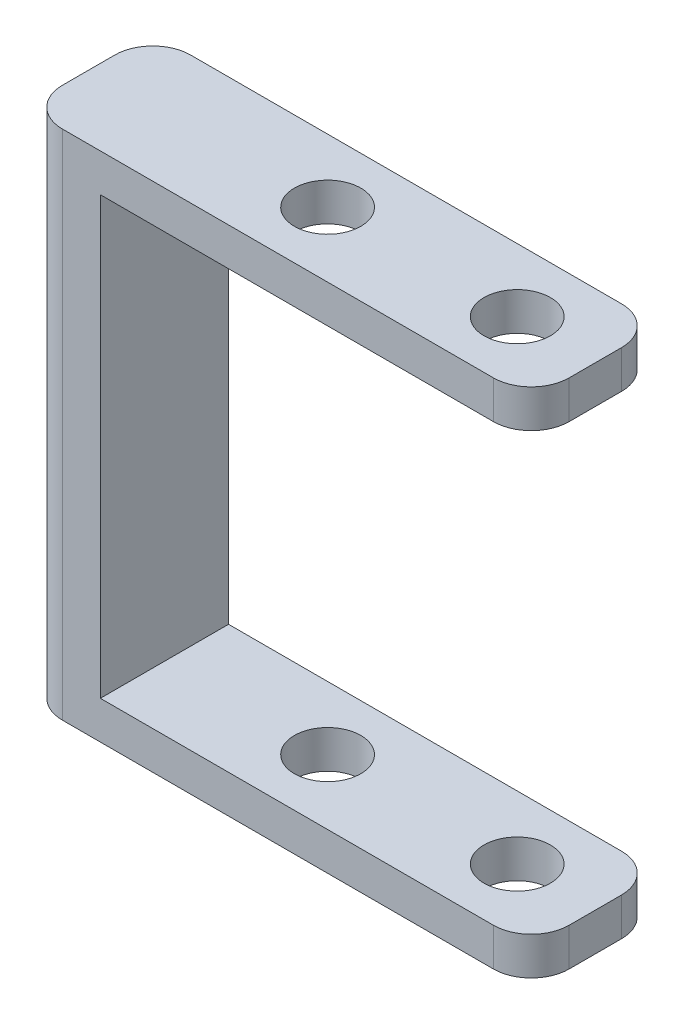
ISO-10303-21;
HEADER;
FILE_DESCRIPTION(('STEP AP214'),'2;1');
FILE_NAME('part.step','',(''),(''),'','','');
FILE_SCHEMA(('AUTOMOTIVE_DESIGN { 1 0 10303 214 1 1 1 1 }'));
ENDSEC;
DATA;
#1=APPLICATION_CONTEXT('core data for automotive mechanical design processes');
#2=APPLICATION_PROTOCOL_DEFINITION('international standard','automotive_design',2000,#1);
#3=PRODUCT_CONTEXT('',#1,'mechanical');
#4=PRODUCT('Part','Part','',(#3));
#5=PRODUCT_RELATED_PRODUCT_CATEGORY('part','',(#4));
#6=PRODUCT_DEFINITION_FORMATION('','',#4);
#7=PRODUCT_DEFINITION_CONTEXT('part definition',#1,'design');
#8=PRODUCT_DEFINITION('design','',#6,#7);
#9=PRODUCT_DEFINITION_SHAPE('','',#8);
#10=(LENGTH_UNIT() NAMED_UNIT(*) SI_UNIT(.MILLI.,.METRE.));
#11=(NAMED_UNIT(*) PLANE_ANGLE_UNIT() SI_UNIT($,.RADIAN.));
#12=(NAMED_UNIT(*) SI_UNIT($,.STERADIAN.) SOLID_ANGLE_UNIT());
#13=UNCERTAINTY_MEASURE_WITH_UNIT(LENGTH_MEASURE(1.E-05),#10,'distance_accuracy_value','');
#14=(GEOMETRIC_REPRESENTATION_CONTEXT(3) GLOBAL_UNCERTAINTY_ASSIGNED_CONTEXT((#13)) GLOBAL_UNIT_ASSIGNED_CONTEXT((#10,
#11,#12)) REPRESENTATION_CONTEXT('',''));
#15=CARTESIAN_POINT('',(0.,0.,0.));
#16=DIRECTION('',(0.,0.,1.));
#17=DIRECTION('',(1.,0.,0.));
#18=AXIS2_PLACEMENT_3D('',#15,#16,#17);
#19=CARTESIAN_POINT('',(8.71849977906767,27.,1.11248743584465));
#20=DIRECTION('',(0.,-1.,0.));
#21=DIRECTION('',(0.,0.,-1.));
#22=AXIS2_PLACEMENT_3D('',#19,#20,#21);
#23=CYLINDRICAL_SURFACE('',#22,2.);
#24=DIRECTION('',(0.,-1.,0.));
#25=VECTOR('',#24,1.);
#26=CARTESIAN_POINT('',(8.71849977906766,27.,3.11248743584465));
#27=LINE('',#26,#25);
#28=CARTESIAN_POINT('',(8.71849977906766,27.,3.11248743584465));
#29=VERTEX_POINT('',#28);
#30=CARTESIAN_POINT('',(8.71849977906765,25.,3.11248743584465));
#31=VERTEX_POINT('',#30);
#32=EDGE_CURVE('E170',#29,#31,#27,.T.);
#33=ORIENTED_EDGE('',*,*,#32,.T.);
#34=CARTESIAN_POINT('',(8.71849977906767,25.,1.11248743584465));
#35=DIRECTION('',(0.,1.,0.));
#36=DIRECTION('',(0.,0.,1.));
#37=AXIS2_PLACEMENT_3D('',#34,#35,#36);
#38=CIRCLE('',#37,2.);
#39=CARTESIAN_POINT('',(10.7184997790677,25.,1.11248743584463));
#40=VERTEX_POINT('',#39);
#41=EDGE_CURVE('E221',#31,#40,#38,.T.);
#42=ORIENTED_EDGE('',*,*,#41,.T.);
#43=DIRECTION('',(0.,-1.,0.));
#44=VECTOR('',#43,1.);
#45=CARTESIAN_POINT('',(10.7184997790677,27.,1.11248743584463));
#46=LINE('',#45,#44);
#47=CARTESIAN_POINT('',(10.7184997790677,27.,1.11248743584463));
#48=VERTEX_POINT('',#47);
#49=EDGE_CURVE('E11',#48,#40,#46,.T.);
#50=ORIENTED_EDGE('',*,*,#49,.F.);
#51=CARTESIAN_POINT('',(8.71849977906767,27.,1.11248743584465));
#52=DIRECTION('',(0.,1.,0.));
#53=DIRECTION('',(0.,0.,1.));
#54=AXIS2_PLACEMENT_3D('',#51,#52,#53);
#55=CIRCLE('',#54,2.);
#56=EDGE_CURVE('E169',#29,#48,#55,.T.);
#57=ORIENTED_EDGE('',*,*,#56,.F.);
#58=EDGE_LOOP('',(#33,#42,#50,#57));
#59=FACE_BOUND('',#58,.T.);
#60=ADVANCED_FACE('F39',(#59),#23,.T.);
#61=CARTESIAN_POINT('',(10.7184997790677,27.,-1.64841242479802));
#62=DIRECTION('',(-1.,0.,0.));
#63=DIRECTION('',(0.,0.,1.));
#64=AXIS2_PLACEMENT_3D('',#61,#62,#63);
#65=PLANE('',#64);
#66=ORIENTED_EDGE('',*,*,#49,.T.);
#67=DIRECTION('',(0.,0.,-1.));
#68=VECTOR('',#67,1.);
#69=CARTESIAN_POINT('',(10.7184997790677,25.,-1.64841242479802));
#70=LINE('',#69,#68);
#71=CARTESIAN_POINT('',(10.7184997790677,25.,-1.64841242479802));
#72=VERTEX_POINT('',#71);
#73=EDGE_CURVE('E218',#40,#72,#70,.T.);
#74=ORIENTED_EDGE('',*,*,#73,.T.);
#75=DIRECTION('',(0.,-1.,0.));
#76=VECTOR('',#75,1.);
#77=CARTESIAN_POINT('',(10.7184997790677,27.,-1.64841242479802));
#78=LINE('',#77,#76);
#79=CARTESIAN_POINT('',(10.7184997790677,27.,-1.64841242479802));
#80=VERTEX_POINT('',#79);
#81=EDGE_CURVE('E183',#80,#72,#78,.T.);
#82=ORIENTED_EDGE('',*,*,#81,.F.);
#83=DIRECTION('',(0.,0.,-1.));
#84=VECTOR('',#83,1.);
#85=CARTESIAN_POINT('',(10.7184997790677,27.,-1.64841242479802));
#86=LINE('',#85,#84);
#87=EDGE_CURVE('E107',#48,#80,#86,.T.);
#88=ORIENTED_EDGE('',*,*,#87,.F.);
#89=EDGE_LOOP('',(#66,#74,#82,#88));
#90=FACE_BOUND('',#89,.T.);
#91=ADVANCED_FACE('F263',(#90),#65,.F.);
#92=CARTESIAN_POINT('',(8.71849977906767,27.,-1.64841242479804));
#93=DIRECTION('',(0.,-1.,0.));
#94=DIRECTION('',(0.,0.,-1.));
#95=AXIS2_PLACEMENT_3D('',#92,#93,#94);
#96=CYLINDRICAL_SURFACE('',#95,2.);
#97=ORIENTED_EDGE('',*,*,#81,.T.);
#98=CARTESIAN_POINT('',(8.71849977906767,25.,-1.64841242479804));
#99=DIRECTION('',(0.,1.,0.));
#100=DIRECTION('',(0.,0.,1.));
#101=AXIS2_PLACEMENT_3D('',#98,#99,#100);
#102=CIRCLE('',#101,2.);
#103=CARTESIAN_POINT('',(8.71849977906765,25.,-3.64841242479804));
#104=VERTEX_POINT('',#103);
#105=EDGE_CURVE('E215',#72,#104,#102,.T.);
#106=ORIENTED_EDGE('',*,*,#105,.T.);
#107=DIRECTION('',(0.,-1.,0.));
#108=VECTOR('',#107,1.);
#109=CARTESIAN_POINT('',(8.71849977906766,27.,-3.64841242479804));
#110=LINE('',#109,#108);
#111=CARTESIAN_POINT('',(8.71849977906766,27.,-3.64841242479804));
#112=VERTEX_POINT('',#111);
#113=EDGE_CURVE('E179',#112,#104,#110,.T.);
#114=ORIENTED_EDGE('',*,*,#113,.F.);
#115=CARTESIAN_POINT('',(8.71849977906767,27.,-1.64841242479804));
#116=DIRECTION('',(0.,1.,0.));
#117=DIRECTION('',(0.,0.,-1.));
#118=AXIS2_PLACEMENT_3D('',#115,#116,#117);
#119=CIRCLE('',#118,2.);
#120=EDGE_CURVE('E237',#80,#112,#119,.T.);
#121=ORIENTED_EDGE('',*,*,#120,.F.);
#122=EDGE_LOOP('',(#97,#106,#114,#121));
#123=FACE_BOUND('',#122,.T.);
#124=ADVANCED_FACE('F267',(#123),#96,.T.);
#125=CARTESIAN_POINT('',(-3.44522513510862,27.,-0.309187493626952));
#126=DIRECTION('',(0.,-1.,0.));
#127=DIRECTION('',(0.,0.,-1.));
#128=AXIS2_PLACEMENT_3D('',#125,#126,#127);
#129=CYLINDRICAL_SURFACE('',#128,1.75);
#130=CARTESIAN_POINT('',(-3.44522513510862,25.,-0.309187493626952));
#131=DIRECTION('',(0.,1.,0.));
#132=DIRECTION('',(0.,0.,1.));
#133=AXIS2_PLACEMENT_3D('',#130,#131,#132);
#134=CIRCLE('',#133,1.75);
#135=CARTESIAN_POINT('',(-3.44522513510862,25.,1.44081250637305));
#136=VERTEX_POINT('',#135);
#137=EDGE_CURVE('E212',#136,#136,#134,.T.);
#138=ORIENTED_EDGE('',*,*,#137,.F.);
#139=EDGE_LOOP('',(#138));
#140=FACE_BOUND('',#139,.T.);
#141=CARTESIAN_POINT('',(-3.44522513510862,27.,-0.309187493626952));
#142=DIRECTION('',(0.,1.,0.));
#143=DIRECTION('',(0.,0.,1.));
#144=AXIS2_PLACEMENT_3D('',#141,#142,#143);
#145=CIRCLE('',#144,1.75);
#146=CARTESIAN_POINT('',(-3.44522513510862,27.,1.44081250637305));
#147=VERTEX_POINT('',#146);
#148=EDGE_CURVE('E154',#147,#147,#145,.T.);
#149=ORIENTED_EDGE('',*,*,#148,.T.);
#150=EDGE_LOOP('',(#149));
#151=FACE_BOUND('',#150,.T.);
#152=ADVANCED_FACE('F324',(#140,#151),#129,.F.);
#153=CARTESIAN_POINT('',(6.55477486489138,27.,-0.309187493626952));
#154=DIRECTION('',(0.,-1.,0.));
#155=DIRECTION('',(0.,0.,-1.));
#156=AXIS2_PLACEMENT_3D('',#153,#154,#155);
#157=CYLINDRICAL_SURFACE('',#156,1.75);
#158=CARTESIAN_POINT('',(6.55477486489138,25.,-0.309187493626952));
#159=DIRECTION('',(0.,1.,0.));
#160=DIRECTION('',(0.,0.,1.));
#161=AXIS2_PLACEMENT_3D('',#158,#159,#160);
#162=CIRCLE('',#161,1.75);
#163=CARTESIAN_POINT('',(6.55477486489138,25.,1.44081250637305));
#164=VERTEX_POINT('',#163);
#165=EDGE_CURVE('E43',#164,#164,#162,.T.);
#166=ORIENTED_EDGE('',*,*,#165,.F.);
#167=EDGE_LOOP('',(#166));
#168=FACE_BOUND('',#167,.T.);
#169=CARTESIAN_POINT('',(6.55477486489138,27.,-0.309187493626952));
#170=DIRECTION('',(0.,1.,0.));
#171=DIRECTION('',(0.,0.,1.));
#172=AXIS2_PLACEMENT_3D('',#169,#170,#171);
#173=CIRCLE('',#172,1.75);
#174=CARTESIAN_POINT('',(6.55477486489138,27.,1.44081250637305));
#175=VERTEX_POINT('',#174);
#176=EDGE_CURVE('E225',#175,#175,#173,.T.);
#177=ORIENTED_EDGE('',*,*,#176,.T.);
#178=EDGE_LOOP('',(#177));
#179=FACE_BOUND('',#178,.T.);
#180=ADVANCED_FACE('F337',(#168,#179),#157,.F.);
#181=CARTESIAN_POINT('',(8.71849977906767,27.,1.11248743584465));
#182=DIRECTION('',(0.,1.,0.));
#183=DIRECTION('',(0.,0.,1.));
#184=AXIS2_PLACEMENT_3D('',#181,#182,#183);
#185=PLANE('',#184);
#186=ORIENTED_EDGE('',*,*,#148,.F.);
#187=EDGE_LOOP('',(#186));
#188=FACE_BOUND('',#187,.T.);
#189=ORIENTED_EDGE('',*,*,#56,.T.);
#190=ORIENTED_EDGE('',*,*,#87,.T.);
#191=ORIENTED_EDGE('',*,*,#120,.T.);
#192=DIRECTION('',(-1.,0.,0.));
#193=VECTOR('',#192,1.);
#194=CARTESIAN_POINT('',(-14.0069651083105,27.,-3.64841242479804));
#195=LINE('',#194,#193);
#196=CARTESIAN_POINT('',(-14.0069651083105,27.,-3.64841242479804));
#197=VERTEX_POINT('',#196);
#198=EDGE_CURVE('E239',#112,#197,#195,.T.);
#199=ORIENTED_EDGE('',*,*,#198,.T.);
#200=CARTESIAN_POINT('',(-14.0069651083105,27.,-1.64841242479804));
#201=DIRECTION('',(0.,1.,0.));
#202=DIRECTION('',(0.,0.,1.));
#203=AXIS2_PLACEMENT_3D('',#200,#201,#202);
#204=CIRCLE('',#203,2.);
#205=CARTESIAN_POINT('',(-16.0069651083105,27.,-1.64841242479804));
#206=VERTEX_POINT('',#205);
#207=EDGE_CURVE('E130',#197,#206,#204,.T.);
#208=ORIENTED_EDGE('',*,*,#207,.T.);
#209=DIRECTION('',(0.,0.,1.));
#210=VECTOR('',#209,1.);
#211=CARTESIAN_POINT('',(-16.0069651083105,27.,-1.64841242479804));
#212=LINE('',#211,#210);
#213=CARTESIAN_POINT('',(-16.0069651083105,27.,1.11248743584465));
#214=VERTEX_POINT('',#213);
#215=EDGE_CURVE('E122',#206,#214,#212,.T.);
#216=ORIENTED_EDGE('',*,*,#215,.T.);
#217=CARTESIAN_POINT('',(-14.0069651083105,27.,1.11248743584465));
#218=DIRECTION('',(0.,1.,0.));
#219=DIRECTION('',(0.,0.,1.));
#220=AXIS2_PLACEMENT_3D('',#217,#218,#219);
#221=CIRCLE('',#220,2.);
#222=CARTESIAN_POINT('',(-14.0069651083105,27.,3.11248743584465));
#223=VERTEX_POINT('',#222);
#224=EDGE_CURVE('E127',#214,#223,#221,.T.);
#225=ORIENTED_EDGE('',*,*,#224,.T.);
#226=DIRECTION('',(1.,0.,0.));
#227=VECTOR('',#226,1.);
#228=CARTESIAN_POINT('',(-14.0069651083105,27.,3.11248743584465));
#229=LINE('',#228,#227);
#230=EDGE_CURVE('E65',#223,#29,#229,.T.);
#231=ORIENTED_EDGE('',*,*,#230,.T.);
#232=EDGE_LOOP('',(#189,#190,#191,#199,#208,#216,#225,#231));
#233=FACE_BOUND('',#232,.T.);
#234=ORIENTED_EDGE('',*,*,#176,.F.);
#235=EDGE_LOOP('',(#234));
#236=FACE_BOUND('',#235,.T.);
#237=ADVANCED_FACE('F124',(#188,#233,#236),#185,.T.);
#238=CARTESIAN_POINT('',(8.71849977906767,0.,1.11248743584465));
#239=DIRECTION('',(0.,1.,0.));
#240=DIRECTION('',(0.,0.,1.));
#241=AXIS2_PLACEMENT_3D('',#238,#239,#240);
#242=PLANE('',#241);
#243=CARTESIAN_POINT('',(8.71849977906767,0.,1.11248743584465));
#244=DIRECTION('',(0.,1.,0.));
#245=DIRECTION('',(0.,0.,1.));
#246=AXIS2_PLACEMENT_3D('',#243,#244,#245);
#247=CIRCLE('',#246,2.);
#248=CARTESIAN_POINT('',(8.71849977906766,0.,3.11248743584465));
#249=VERTEX_POINT('',#248);
#250=CARTESIAN_POINT('',(10.7184997790677,0.,1.11248743584463));
#251=VERTEX_POINT('',#250);
#252=EDGE_CURVE('E151',#249,#251,#247,.T.);
#253=ORIENTED_EDGE('',*,*,#252,.F.);
#254=DIRECTION('',(1.,0.,0.));
#255=VECTOR('',#254,1.);
#256=CARTESIAN_POINT('',(-14.0069651083105,0.,3.11248743584465));
#257=LINE('',#256,#255);
#258=CARTESIAN_POINT('',(-14.0069651083105,0.,3.11248743584465));
#259=VERTEX_POINT('',#258);
#260=EDGE_CURVE('E167',#259,#249,#257,.T.);
#261=ORIENTED_EDGE('',*,*,#260,.F.);
#262=CARTESIAN_POINT('',(-14.0069651083105,0.,1.11248743584465));
#263=DIRECTION('',(0.,1.,0.));
#264=DIRECTION('',(0.,0.,1.));
#265=AXIS2_PLACEMENT_3D('',#262,#263,#264);
#266=CIRCLE('',#265,2.);
#267=CARTESIAN_POINT('',(-16.0069651083105,0.,1.11248743584465));
#268=VERTEX_POINT('',#267);
#269=EDGE_CURVE('E165',#268,#259,#266,.T.);
#270=ORIENTED_EDGE('',*,*,#269,.F.);
#271=DIRECTION('',(0.,0.,1.));
#272=VECTOR('',#271,1.);
#273=CARTESIAN_POINT('',(-16.0069651083105,0.,-1.64841242479804));
#274=LINE('',#273,#272);
#275=CARTESIAN_POINT('',(-16.0069651083105,0.,-1.64841242479804));
#276=VERTEX_POINT('',#275);
#277=EDGE_CURVE('E139',#276,#268,#274,.T.);
#278=ORIENTED_EDGE('',*,*,#277,.F.);
#279=CARTESIAN_POINT('',(-14.0069651083105,0.,-1.64841242479804));
#280=DIRECTION('',(0.,1.,0.));
#281=DIRECTION('',(0.,0.,1.));
#282=AXIS2_PLACEMENT_3D('',#279,#280,#281);
#283=CIRCLE('',#282,2.);
#284=CARTESIAN_POINT('',(-14.0069651083105,0.,-3.64841242479804));
#285=VERTEX_POINT('',#284);
#286=EDGE_CURVE('E162',#285,#276,#283,.T.);
#287=ORIENTED_EDGE('',*,*,#286,.F.);
#288=DIRECTION('',(-1.,0.,0.));
#289=VECTOR('',#288,1.);
#290=CARTESIAN_POINT('',(-14.0069651083105,0.,-3.64841242479804));
#291=LINE('',#290,#289);
#292=CARTESIAN_POINT('',(8.71849977906766,0.,-3.64841242479804));
#293=VERTEX_POINT('',#292);
#294=EDGE_CURVE('E160',#293,#285,#291,.T.);
#295=ORIENTED_EDGE('',*,*,#294,.F.);
#296=CARTESIAN_POINT('',(8.71849977906767,0.,-1.64841242479804));
#297=DIRECTION('',(0.,1.,0.));
#298=DIRECTION('',(0.,0.,-1.));
#299=AXIS2_PLACEMENT_3D('',#296,#297,#298);
#300=CIRCLE('',#299,2.);
#301=CARTESIAN_POINT('',(10.7184997790677,0.,-1.64841242479802));
#302=VERTEX_POINT('',#301);
#303=EDGE_CURVE('E157',#302,#293,#300,.T.);
#304=ORIENTED_EDGE('',*,*,#303,.F.);
#305=DIRECTION('',(0.,0.,-1.));
#306=VECTOR('',#305,1.);
#307=CARTESIAN_POINT('',(10.7184997790677,0.,-1.64841242479802));
#308=LINE('',#307,#306);
#309=EDGE_CURVE('E153',#251,#302,#308,.T.);
#310=ORIENTED_EDGE('',*,*,#309,.F.);
#311=EDGE_LOOP('',(#253,#261,#270,#278,#287,#295,#304,#310));
#312=FACE_BOUND('',#311,.T.);
#313=CARTESIAN_POINT('',(-3.44522513510862,0.,-0.309187493626952));
#314=DIRECTION('',(0.,1.,0.));
#315=DIRECTION('',(0.,0.,1.));
#316=AXIS2_PLACEMENT_3D('',#313,#314,#315);
#317=CIRCLE('',#316,1.75);
#318=CARTESIAN_POINT('',(-3.44522513510862,0.,1.44081250637305));
#319=VERTEX_POINT('',#318);
#320=EDGE_CURVE('E228',#319,#319,#317,.T.);
#321=ORIENTED_EDGE('',*,*,#320,.T.);
#322=EDGE_LOOP('',(#321));
#323=FACE_BOUND('',#322,.T.);
#324=CARTESIAN_POINT('',(6.55477486489138,0.,-0.309187493626952));
#325=DIRECTION('',(0.,1.,0.));
#326=DIRECTION('',(0.,0.,1.));
#327=AXIS2_PLACEMENT_3D('',#324,#325,#326);
#328=CIRCLE('',#327,1.75);
#329=CARTESIAN_POINT('',(6.55477486489138,0.,1.44081250637305));
#330=VERTEX_POINT('',#329);
#331=EDGE_CURVE('E224',#330,#330,#328,.T.);
#332=ORIENTED_EDGE('',*,*,#331,.T.);
#333=EDGE_LOOP('',(#332));
#334=FACE_BOUND('',#333,.T.);
#335=ADVANCED_FACE('F252',(#312,#323,#334),#242,.F.);
#336=CARTESIAN_POINT('',(10.7184997790677,2.,1.11248743584463));
#337=VERTEX_POINT('',#336);
#338=EDGE_CURVE('E48',#337,#251,#46,.T.);
#339=ORIENTED_EDGE('',*,*,#338,.F.);
#340=CARTESIAN_POINT('',(8.71849977906767,2.,1.11248743584465));
#341=DIRECTION('',(0.,-1.,0.));
#342=DIRECTION('',(0.,0.,-1.));
#343=AXIS2_PLACEMENT_3D('',#340,#341,#342);
#344=CIRCLE('',#343,2.);
#345=CARTESIAN_POINT('',(8.71849977906765,2.,3.11248743584465));
#346=VERTEX_POINT('',#345);
#347=EDGE_CURVE('E210',#337,#346,#344,.T.);
#348=ORIENTED_EDGE('',*,*,#347,.T.);
#349=EDGE_CURVE('E99',#346,#249,#27,.T.);
#350=ORIENTED_EDGE('',*,*,#349,.T.);
#351=ORIENTED_EDGE('',*,*,#252,.T.);
#352=EDGE_LOOP('',(#339,#348,#350,#351));
#353=FACE_BOUND('',#352,.T.);
#354=ADVANCED_FACE('F41',(#353),#23,.T.);
#355=CARTESIAN_POINT('',(10.7184997790677,2.,-1.64841242479802));
#356=VERTEX_POINT('',#355);
#357=EDGE_CURVE('E182',#356,#302,#78,.T.);
#358=ORIENTED_EDGE('',*,*,#357,.F.);
#359=DIRECTION('',(0.,0.,1.));
#360=VECTOR('',#359,1.);
#361=CARTESIAN_POINT('',(10.7184997790677,2.,-1.64841242479802));
#362=LINE('',#361,#360);
#363=EDGE_CURVE('E207',#356,#337,#362,.T.);
#364=ORIENTED_EDGE('',*,*,#363,.T.);
#365=ORIENTED_EDGE('',*,*,#338,.T.);
#366=ORIENTED_EDGE('',*,*,#309,.T.);
#367=EDGE_LOOP('',(#358,#364,#365,#366));
#368=FACE_BOUND('',#367,.T.);
#369=ADVANCED_FACE('F312',(#368),#65,.F.);
#370=CARTESIAN_POINT('',(8.71849977906765,2.,-3.64841242479804));
#371=VERTEX_POINT('',#370);
#372=EDGE_CURVE('E178',#371,#293,#110,.T.);
#373=ORIENTED_EDGE('',*,*,#372,.F.);
#374=CARTESIAN_POINT('',(8.71849977906767,2.,-1.64841242479804));
#375=DIRECTION('',(0.,-1.,0.));
#376=DIRECTION('',(0.,0.,-1.));
#377=AXIS2_PLACEMENT_3D('',#374,#375,#376);
#378=CIRCLE('',#377,2.);
#379=EDGE_CURVE('E192',#371,#356,#378,.T.);
#380=ORIENTED_EDGE('',*,*,#379,.T.);
#381=ORIENTED_EDGE('',*,*,#357,.T.);
#382=ORIENTED_EDGE('',*,*,#303,.T.);
#383=EDGE_LOOP('',(#373,#380,#381,#382));
#384=FACE_BOUND('',#383,.T.);
#385=ADVANCED_FACE('F315',(#384),#96,.T.);
#386=CARTESIAN_POINT('',(-14.0069651083105,27.,-3.64841242479804));
#387=DIRECTION('',(0.,0.,1.));
#388=DIRECTION('',(1.,0.,0.));
#389=AXIS2_PLACEMENT_3D('',#386,#387,#388);
#390=PLANE('',#389);
#391=ORIENTED_EDGE('',*,*,#113,.T.);
#392=DIRECTION('',(-1.,0.,0.));
#393=VECTOR('',#392,1.);
#394=CARTESIAN_POINT('',(-12.0069651083105,25.,-3.64841242479804));
#395=LINE('',#394,#393);
#396=CARTESIAN_POINT('',(-12.0069651083105,25.,-3.64841242479804));
#397=VERTEX_POINT('',#396);
#398=EDGE_CURVE('E199',#104,#397,#395,.T.);
#399=ORIENTED_EDGE('',*,*,#398,.T.);
#400=DIRECTION('',(0.,-1.,0.));
#401=VECTOR('',#400,1.);
#402=CARTESIAN_POINT('',(-12.0069651083105,25.,-3.64841242479804));
#403=LINE('',#402,#401);
#404=CARTESIAN_POINT('',(-12.0069651083105,2.,-3.64841242479804));
#405=VERTEX_POINT('',#404);
#406=EDGE_CURVE('E296',#397,#405,#403,.T.);
#407=ORIENTED_EDGE('',*,*,#406,.T.);
#408=DIRECTION('',(1.,0.,0.));
#409=VECTOR('',#408,1.);
#410=CARTESIAN_POINT('',(-12.0069651083105,2.,-3.64841242479804));
#411=LINE('',#410,#409);
#412=EDGE_CURVE('E300',#405,#371,#411,.T.);
#413=ORIENTED_EDGE('',*,*,#412,.T.);
#414=ORIENTED_EDGE('',*,*,#372,.T.);
#415=ORIENTED_EDGE('',*,*,#294,.T.);
#416=DIRECTION('',(0.,-1.,0.));
#417=VECTOR('',#416,1.);
#418=CARTESIAN_POINT('',(-14.0069651083105,27.,-3.64841242479804));
#419=LINE('',#418,#417);
#420=EDGE_CURVE('E175',#197,#285,#419,.T.);
#421=ORIENTED_EDGE('',*,*,#420,.F.);
#422=ORIENTED_EDGE('',*,*,#198,.F.);
#423=EDGE_LOOP('',(#391,#399,#407,#413,#414,#415,#421,#422));
#424=FACE_BOUND('',#423,.T.);
#425=ADVANCED_FACE('F245',(#424),#390,.F.);
#426=CARTESIAN_POINT('',(-14.0069651083105,27.,-1.64841242479804));
#427=DIRECTION('',(0.,-1.,0.));
#428=DIRECTION('',(0.,0.,-1.));
#429=AXIS2_PLACEMENT_3D('',#426,#427,#428);
#430=CYLINDRICAL_SURFACE('',#429,2.);
#431=ORIENTED_EDGE('',*,*,#286,.T.);
#432=DIRECTION('',(0.,-1.,0.));
#433=VECTOR('',#432,1.);
#434=CARTESIAN_POINT('',(-16.0069651083105,27.,-1.64841242479804));
#435=LINE('',#434,#433);
#436=EDGE_CURVE('E142',#206,#276,#435,.T.);
#437=ORIENTED_EDGE('',*,*,#436,.F.);
#438=ORIENTED_EDGE('',*,*,#207,.F.);
#439=ORIENTED_EDGE('',*,*,#420,.T.);
#440=EDGE_LOOP('',(#431,#437,#438,#439));
#441=FACE_BOUND('',#440,.T.);
#442=ADVANCED_FACE('F249',(#441),#430,.T.);
#443=CARTESIAN_POINT('',(-16.0069651083105,27.,-1.64841242479804));
#444=DIRECTION('',(1.,0.,0.));
#445=DIRECTION('',(0.,0.,-1.));
#446=AXIS2_PLACEMENT_3D('',#443,#444,#445);
#447=PLANE('',#446);
#448=ORIENTED_EDGE('',*,*,#277,.T.);
#449=DIRECTION('',(0.,-1.,0.));
#450=VECTOR('',#449,1.);
#451=CARTESIAN_POINT('',(-16.0069651083105,27.,1.11248743584465));
#452=LINE('',#451,#450);
#453=EDGE_CURVE('E136',#214,#268,#452,.T.);
#454=ORIENTED_EDGE('',*,*,#453,.F.);
#455=ORIENTED_EDGE('',*,*,#215,.F.);
#456=ORIENTED_EDGE('',*,*,#436,.T.);
#457=EDGE_LOOP('',(#448,#454,#455,#456));
#458=FACE_BOUND('',#457,.T.);
#459=ADVANCED_FACE('F137',(#458),#447,.F.);
#460=CARTESIAN_POINT('',(-14.0069651083105,27.,1.11248743584465));
#461=DIRECTION('',(0.,-1.,0.));
#462=DIRECTION('',(0.,0.,-1.));
#463=AXIS2_PLACEMENT_3D('',#460,#461,#462);
#464=CYLINDRICAL_SURFACE('',#463,2.);
#465=ORIENTED_EDGE('',*,*,#269,.T.);
#466=DIRECTION('',(0.,-1.,0.));
#467=VECTOR('',#466,1.);
#468=CARTESIAN_POINT('',(-14.0069651083105,27.,3.11248743584465));
#469=LINE('',#468,#467);
#470=EDGE_CURVE('E143',#223,#259,#469,.T.);
#471=ORIENTED_EDGE('',*,*,#470,.F.);
#472=ORIENTED_EDGE('',*,*,#224,.F.);
#473=ORIENTED_EDGE('',*,*,#453,.T.);
#474=EDGE_LOOP('',(#465,#471,#472,#473));
#475=FACE_BOUND('',#474,.T.);
#476=ADVANCED_FACE('F145',(#475),#464,.T.);
#477=CARTESIAN_POINT('',(-14.0069651083105,27.,3.11248743584465));
#478=DIRECTION('',(0.,0.,-1.));
#479=DIRECTION('',(-1.,0.,0.));
#480=AXIS2_PLACEMENT_3D('',#477,#478,#479);
#481=PLANE('',#480);
#482=DIRECTION('',(0.,-1.,0.));
#483=VECTOR('',#482,1.);
#484=CARTESIAN_POINT('',(-12.0069651083105,25.,3.11248743584465));
#485=LINE('',#484,#483);
#486=CARTESIAN_POINT('',(-12.0069651083105,25.,3.11248743584465));
#487=VERTEX_POINT('',#486);
#488=CARTESIAN_POINT('',(-12.0069651083105,2.,3.11248743584465));
#489=VERTEX_POINT('',#488);
#490=EDGE_CURVE('E56',#487,#489,#485,.T.);
#491=ORIENTED_EDGE('',*,*,#490,.F.);
#492=DIRECTION('',(-1.,0.,0.));
#493=VECTOR('',#492,1.);
#494=CARTESIAN_POINT('',(-12.0069651083105,25.,3.11248743584465));
#495=LINE('',#494,#493);
#496=EDGE_CURVE('E202',#31,#487,#495,.T.);
#497=ORIENTED_EDGE('',*,*,#496,.F.);
#498=ORIENTED_EDGE('',*,*,#32,.F.);
#499=ORIENTED_EDGE('',*,*,#230,.F.);
#500=ORIENTED_EDGE('',*,*,#470,.T.);
#501=ORIENTED_EDGE('',*,*,#260,.T.);
#502=ORIENTED_EDGE('',*,*,#349,.F.);
#503=DIRECTION('',(1.,0.,0.));
#504=VECTOR('',#503,1.);
#505=CARTESIAN_POINT('',(-12.0069651083105,2.,3.11248743584465));
#506=LINE('',#505,#504);
#507=EDGE_CURVE('E305',#489,#346,#506,.T.);
#508=ORIENTED_EDGE('',*,*,#507,.F.);
#509=EDGE_LOOP('',(#491,#497,#498,#499,#500,#501,#502,#508));
#510=FACE_BOUND('',#509,.T.);
#511=ADVANCED_FACE('F256',(#510),#481,.F.);
#512=CARTESIAN_POINT('',(-3.44522513510862,2.,-0.309187493626952));
#513=DIRECTION('',(0.,-1.,0.));
#514=DIRECTION('',(0.,0.,-1.));
#515=AXIS2_PLACEMENT_3D('',#512,#513,#514);
#516=CIRCLE('',#515,1.75);
#517=CARTESIAN_POINT('',(-3.44522513510862,2.,-2.05918749362695));
#518=VERTEX_POINT('',#517);
#519=EDGE_CURVE('E187',#518,#518,#516,.T.);
#520=ORIENTED_EDGE('',*,*,#519,.F.);
#521=EDGE_LOOP('',(#520));
#522=FACE_BOUND('',#521,.T.);
#523=ORIENTED_EDGE('',*,*,#320,.F.);
#524=EDGE_LOOP('',(#523));
#525=FACE_BOUND('',#524,.T.);
#526=ADVANCED_FACE('F344',(#522,#525),#129,.F.);
#527=CARTESIAN_POINT('',(6.55477486489138,2.,-0.309187493626952));
#528=DIRECTION('',(0.,-1.,0.));
#529=DIRECTION('',(0.,0.,-1.));
#530=AXIS2_PLACEMENT_3D('',#527,#528,#529);
#531=CIRCLE('',#530,1.75);
#532=CARTESIAN_POINT('',(6.55477486489138,2.,-2.05918749362695));
#533=VERTEX_POINT('',#532);
#534=EDGE_CURVE('E185',#533,#533,#531,.T.);
#535=ORIENTED_EDGE('',*,*,#534,.F.);
#536=EDGE_LOOP('',(#535));
#537=FACE_BOUND('',#536,.T.);
#538=ORIENTED_EDGE('',*,*,#331,.F.);
#539=EDGE_LOOP('',(#538));
#540=FACE_BOUND('',#539,.T.);
#541=ADVANCED_FACE('F372',(#537,#540),#157,.F.);
#542=CARTESIAN_POINT('',(-12.0069651083105,25.,-3.64841242479804));
#543=DIRECTION('',(0.,1.,0.));
#544=DIRECTION('',(0.,0.,1.));
#545=AXIS2_PLACEMENT_3D('',#542,#543,#544);
#546=PLANE('',#545);
#547=ORIENTED_EDGE('',*,*,#137,.T.);
#548=EDGE_LOOP('',(#547));
#549=FACE_BOUND('',#548,.T.);
#550=ORIENTED_EDGE('',*,*,#165,.T.);
#551=EDGE_LOOP('',(#550));
#552=FACE_BOUND('',#551,.T.);
#553=ORIENTED_EDGE('',*,*,#496,.T.);
#554=DIRECTION('',(0.,0.,1.));
#555=VECTOR('',#554,1.);
#556=CARTESIAN_POINT('',(-12.0069651083105,25.,-3.64841242479804));
#557=LINE('',#556,#555);
#558=EDGE_CURVE('E188',#397,#487,#557,.T.);
#559=ORIENTED_EDGE('',*,*,#558,.F.);
#560=ORIENTED_EDGE('',*,*,#398,.F.);
#561=ORIENTED_EDGE('',*,*,#105,.F.);
#562=ORIENTED_EDGE('',*,*,#73,.F.);
#563=ORIENTED_EDGE('',*,*,#41,.F.);
#564=EDGE_LOOP('',(#553,#559,#560,#561,#562,#563));
#565=FACE_BOUND('',#564,.T.);
#566=ADVANCED_FACE('F379',(#549,#552,#565),#546,.F.);
#567=CARTESIAN_POINT('',(-12.0069651083105,2.,-3.64841242479804));
#568=DIRECTION('',(0.,-1.,0.));
#569=DIRECTION('',(0.,0.,-1.));
#570=AXIS2_PLACEMENT_3D('',#567,#568,#569);
#571=PLANE('',#570);
#572=ORIENTED_EDGE('',*,*,#519,.T.);
#573=EDGE_LOOP('',(#572));
#574=FACE_BOUND('',#573,.T.);
#575=ORIENTED_EDGE('',*,*,#534,.T.);
#576=EDGE_LOOP('',(#575));
#577=FACE_BOUND('',#576,.T.);
#578=ORIENTED_EDGE('',*,*,#363,.F.);
#579=ORIENTED_EDGE('',*,*,#379,.F.);
#580=ORIENTED_EDGE('',*,*,#412,.F.);
#581=DIRECTION('',(0.,0.,1.));
#582=VECTOR('',#581,1.);
#583=CARTESIAN_POINT('',(-12.0069651083105,2.,-3.64841242479804));
#584=LINE('',#583,#582);
#585=EDGE_CURVE('E194',#405,#489,#584,.T.);
#586=ORIENTED_EDGE('',*,*,#585,.T.);
#587=ORIENTED_EDGE('',*,*,#507,.T.);
#588=ORIENTED_EDGE('',*,*,#347,.F.);
#589=EDGE_LOOP('',(#578,#579,#580,#586,#587,#588));
#590=FACE_BOUND('',#589,.T.);
#591=ADVANCED_FACE('F301',(#574,#577,#590),#571,.F.);
#592=CARTESIAN_POINT('',(-12.0069651083105,25.,-3.64841242479804));
#593=DIRECTION('',(-1.,0.,0.));
#594=DIRECTION('',(0.,-1.,0.));
#595=AXIS2_PLACEMENT_3D('',#592,#593,#594);
#596=PLANE('',#595);
#597=ORIENTED_EDGE('',*,*,#490,.T.);
#598=ORIENTED_EDGE('',*,*,#585,.F.);
#599=ORIENTED_EDGE('',*,*,#406,.F.);
#600=ORIENTED_EDGE('',*,*,#558,.T.);
#601=EDGE_LOOP('',(#597,#598,#599,#600));
#602=FACE_BOUND('',#601,.T.);
#603=ADVANCED_FACE('F295',(#602),#596,.F.);
#604=CLOSED_SHELL('',(#60,#91,#124,#152,#180,#237,#335,#354,#369,#385,#425,#442,#459,#476,#511,
#526,#541,#566,#591,#603));
#605=MANIFOLD_SOLID_BREP('B2',#604);
#606=ADVANCED_BREP_SHAPE_REPRESENTATION('',(#18,#605),#14);
#607=SHAPE_DEFINITION_REPRESENTATION(#9,#606);
ENDSEC;
END-ISO-10303-21;
